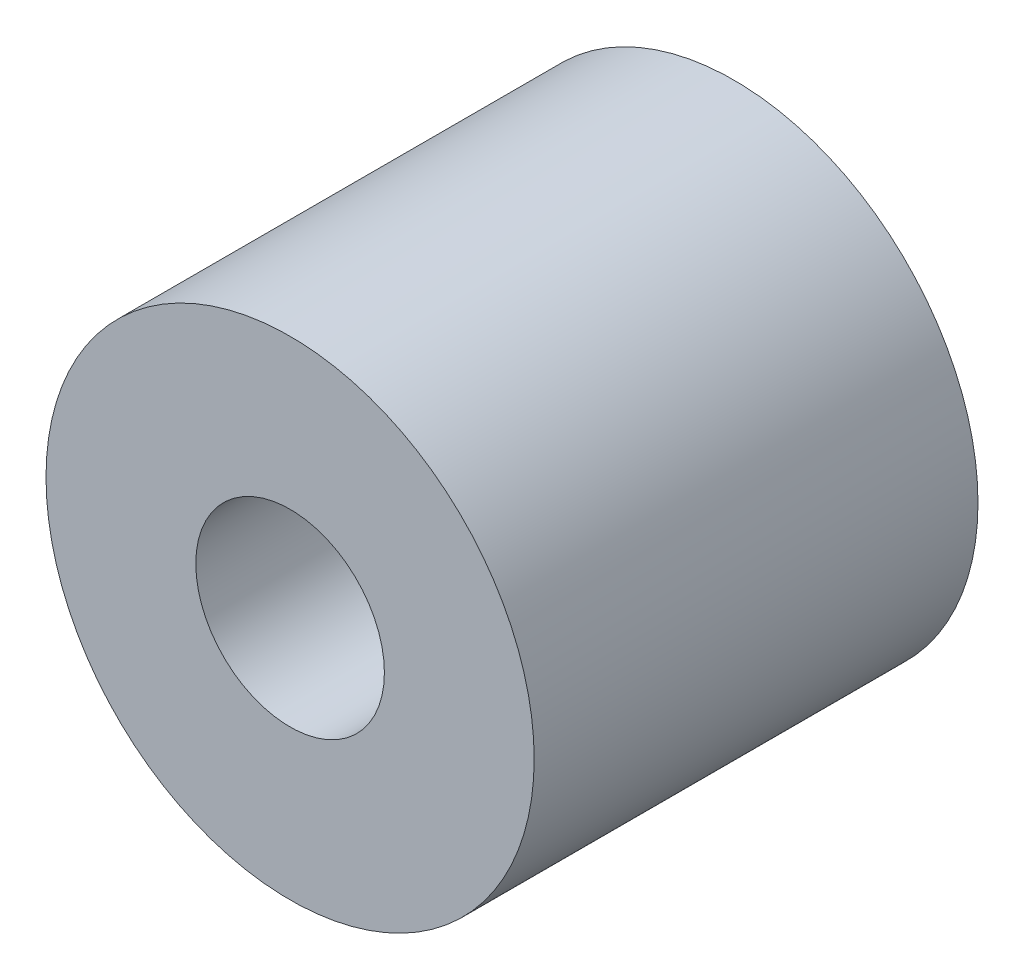
ISO-10303-21;
HEADER;
FILE_DESCRIPTION(('STEP AP214'),'2;1');
FILE_NAME('part.step','',(''),(''),'','','');
FILE_SCHEMA(('AUTOMOTIVE_DESIGN { 1 0 10303 214 1 1 1 1 }'));
ENDSEC;
DATA;
#1=APPLICATION_CONTEXT('core data for automotive mechanical design processes');
#2=APPLICATION_PROTOCOL_DEFINITION('international standard','automotive_design',2000,#1);
#3=PRODUCT_CONTEXT('',#1,'mechanical');
#4=PRODUCT('Part','Part','',(#3));
#5=PRODUCT_RELATED_PRODUCT_CATEGORY('part','',(#4));
#6=PRODUCT_DEFINITION_FORMATION('','',#4);
#7=PRODUCT_DEFINITION_CONTEXT('part definition',#1,'design');
#8=PRODUCT_DEFINITION('design','',#6,#7);
#9=PRODUCT_DEFINITION_SHAPE('','',#8);
#10=(LENGTH_UNIT() NAMED_UNIT(*) SI_UNIT(.MILLI.,.METRE.));
#11=(NAMED_UNIT(*) PLANE_ANGLE_UNIT() SI_UNIT($,.RADIAN.));
#12=(NAMED_UNIT(*) SI_UNIT($,.STERADIAN.) SOLID_ANGLE_UNIT());
#13=UNCERTAINTY_MEASURE_WITH_UNIT(LENGTH_MEASURE(1.E-05),#10,'distance_accuracy_value','');
#14=(GEOMETRIC_REPRESENTATION_CONTEXT(3) GLOBAL_UNCERTAINTY_ASSIGNED_CONTEXT((#13)) GLOBAL_UNIT_ASSIGNED_CONTEXT((#10,
#11,#12)) REPRESENTATION_CONTEXT('',''));
#15=CARTESIAN_POINT('',(0.,0.,0.));
#16=DIRECTION('',(0.,0.,1.));
#17=DIRECTION('',(1.,0.,0.));
#18=AXIS2_PLACEMENT_3D('',#15,#16,#17);
#19=CARTESIAN_POINT('',(0.,0.,-19.45634051241));
#20=DIRECTION('',(0.,0.,1.));
#21=DIRECTION('',(1.,0.,0.));
#22=AXIS2_PLACEMENT_3D('',#19,#20,#21);
#23=CYLINDRICAL_SURFACE('',#22,4.25);
#24=CARTESIAN_POINT('',(0.,0.,10.));
#25=DIRECTION('',(0.,0.,1.));
#26=DIRECTION('',(1.,0.,0.));
#27=AXIS2_PLACEMENT_3D('',#24,#25,#26);
#28=CIRCLE('',#27,4.25);
#29=CARTESIAN_POINT('',(4.25,0.,10.));
#30=VERTEX_POINT('',#29);
#31=EDGE_CURVE('P0_E18',#30,#30,#28,.F.);
#32=ORIENTED_EDGE('',*,*,#31,.F.);
#33=EDGE_LOOP('',(#32));
#34=FACE_BOUND('',#33,.T.);
#35=CARTESIAN_POINT('',(0.,0.,-10.));
#36=DIRECTION('',(0.,0.,1.));
#37=DIRECTION('',(1.,0.,0.));
#38=AXIS2_PLACEMENT_3D('',#35,#36,#37);
#39=CIRCLE('',#38,4.25);
#40=CARTESIAN_POINT('',(4.25,0.,-10.));
#41=VERTEX_POINT('',#40);
#42=EDGE_CURVE('P0_E27',#41,#41,#39,.F.);
#43=ORIENTED_EDGE('',*,*,#42,.T.);
#44=EDGE_LOOP('',(#43));
#45=FACE_BOUND('',#44,.T.);
#46=ADVANCED_FACE('P0_F15',(#34,#45),#23,.F.);
#47=CARTESIAN_POINT('',(0.,0.,10.));
#48=DIRECTION('',(0.,0.,1.));
#49=DIRECTION('',(1.,0.,0.));
#50=AXIS2_PLACEMENT_3D('',#47,#48,#49);
#51=PLANE('',#50);
#52=ORIENTED_EDGE('',*,*,#31,.T.);
#53=EDGE_LOOP('',(#52));
#54=FACE_BOUND('',#53,.T.);
#55=CARTESIAN_POINT('',(0.,0.,10.));
#56=DIRECTION('',(0.,0.,1.));
#57=DIRECTION('',(1.,0.,0.));
#58=AXIS2_PLACEMENT_3D('',#55,#56,#57);
#59=CIRCLE('',#58,11.);
#60=CARTESIAN_POINT('',(11.,0.,10.));
#61=VERTEX_POINT('',#60);
#62=EDGE_CURVE('P0_E22',#61,#61,#59,.F.);
#63=ORIENTED_EDGE('',*,*,#62,.F.);
#64=EDGE_LOOP('',(#63));
#65=FACE_BOUND('',#64,.T.);
#66=ADVANCED_FACE('P0_F35',(#54,#65),#51,.T.);
#67=CARTESIAN_POINT('',(0.,0.,-10.));
#68=DIRECTION('',(0.,0.,1.));
#69=DIRECTION('',(1.,0.,0.));
#70=AXIS2_PLACEMENT_3D('',#67,#68,#69);
#71=PLANE('',#70);
#72=ORIENTED_EDGE('',*,*,#42,.F.);
#73=EDGE_LOOP('',(#72));
#74=FACE_BOUND('',#73,.T.);
#75=CARTESIAN_POINT('',(0.,0.,-10.));
#76=DIRECTION('',(0.,0.,1.));
#77=DIRECTION('',(1.,0.,0.));
#78=AXIS2_PLACEMENT_3D('',#75,#76,#77);
#79=CIRCLE('',#78,11.);
#80=CARTESIAN_POINT('',(11.,0.,-10.));
#81=VERTEX_POINT('',#80);
#82=EDGE_CURVE('P0_E10',#81,#81,#79,.T.);
#83=ORIENTED_EDGE('',*,*,#82,.F.);
#84=EDGE_LOOP('',(#83));
#85=FACE_BOUND('',#84,.T.);
#86=ADVANCED_FACE('P0_F43',(#74,#85),#71,.F.);
#87=CARTESIAN_POINT('',(0.,0.,-10.));
#88=DIRECTION('',(0.,0.,1.));
#89=DIRECTION('',(1.,0.,0.));
#90=AXIS2_PLACEMENT_3D('',#87,#88,#89);
#91=CYLINDRICAL_SURFACE('',#90,11.);
#92=ORIENTED_EDGE('',*,*,#62,.T.);
#93=EDGE_LOOP('',(#92));
#94=FACE_BOUND('',#93,.T.);
#95=ORIENTED_EDGE('',*,*,#82,.T.);
#96=EDGE_LOOP('',(#95));
#97=FACE_BOUND('',#96,.T.);
#98=ADVANCED_FACE('P0_F44',(#94,#97),#91,.T.);
#99=CLOSED_SHELL('',(#46,#66,#86,#98));
#100=MANIFOLD_SOLID_BREP('P0_B1',#99);
#101=CARTESIAN_POINT('',(0.,0.,-19.45634051241));
#102=DIRECTION('',(0.,0.,1.));
#103=DIRECTION('',(1.,0.,0.));
#104=AXIS2_PLACEMENT_3D('',#101,#102,#103);
#105=CYLINDRICAL_SURFACE('',#104,5.);
#106=CARTESIAN_POINT('',(0.,0.,10.));
#107=DIRECTION('',(0.,0.,1.));
#108=DIRECTION('',(1.,0.,0.));
#109=AXIS2_PLACEMENT_3D('',#106,#107,#108);
#110=CIRCLE('',#109,5.);
#111=CARTESIAN_POINT('',(5.,0.,10.));
#112=VERTEX_POINT('',#111);
#113=EDGE_CURVE('P1_E10',#112,#112,#110,.F.);
#114=ORIENTED_EDGE('',*,*,#113,.T.);
#115=EDGE_LOOP('',(#114));
#116=FACE_BOUND('',#115,.T.);
#117=CARTESIAN_POINT('',(0.,0.,-10.));
#118=DIRECTION('',(0.,0.,1.));
#119=DIRECTION('',(1.,0.,0.));
#120=AXIS2_PLACEMENT_3D('',#117,#118,#119);
#121=CIRCLE('',#120,5.);
#122=CARTESIAN_POINT('',(5.,0.,-10.));
#123=VERTEX_POINT('',#122);
#124=EDGE_CURVE('P1_E16',#123,#123,#121,.T.);
#125=ORIENTED_EDGE('',*,*,#124,.T.);
#126=EDGE_LOOP('',(#125));
#127=FACE_BOUND('',#126,.T.);
#128=ADVANCED_FACE('P1_F15',(#116,#127),#105,.T.);
#129=OPEN_SHELL('',(#128));
#130=SHELL_BASED_SURFACE_MODEL('P1_B1',(#129));
#131=ADVANCED_BREP_SHAPE_REPRESENTATION('',(#18,#100),#14);
#132=MANIFOLD_SURFACE_SHAPE_REPRESENTATION('',(#18,#130),#14);
#133=SHAPE_REPRESENTATION('',(#18),#14);
#134=SHAPE_DEFINITION_REPRESENTATION(#9,#133);
#135=SHAPE_REPRESENTATION_RELATIONSHIP('','',#133,#131);
#136=SHAPE_REPRESENTATION_RELATIONSHIP('','',#133,#132);
ENDSEC;
END-ISO-10303-21;
